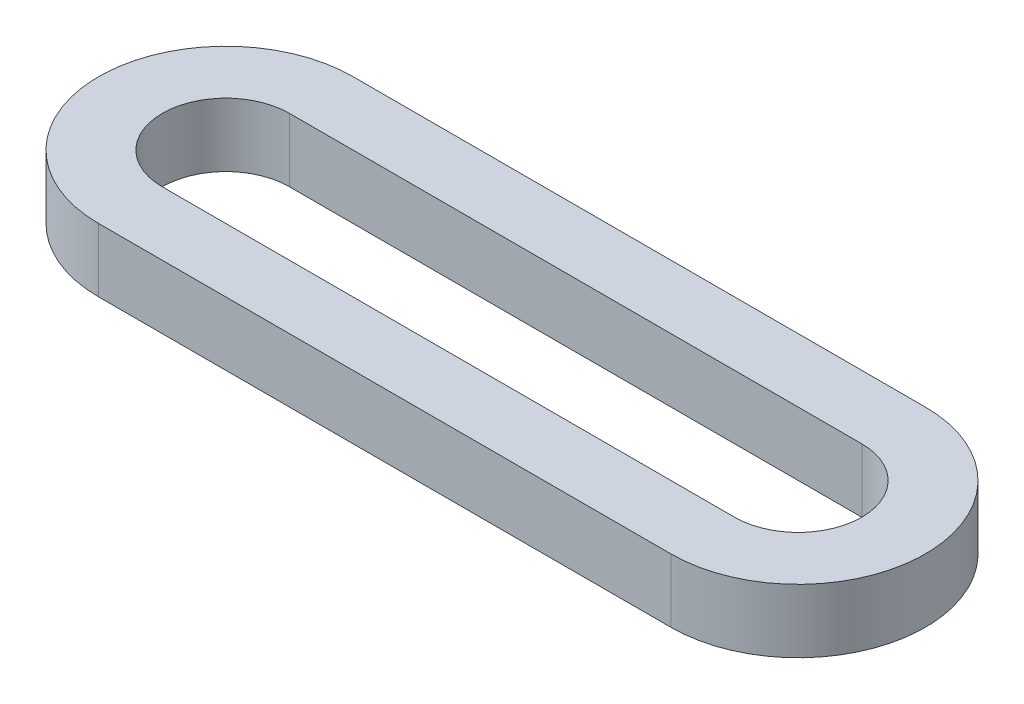
ISO-10303-21;
HEADER;
FILE_DESCRIPTION(('STEP AP214'),'2;1');
FILE_NAME('part.step','',(''),(''),'','','');
FILE_SCHEMA(('AUTOMOTIVE_DESIGN { 1 0 10303 214 1 1 1 1 }'));
ENDSEC;
DATA;
#1=APPLICATION_CONTEXT('core data for automotive mechanical design processes');
#2=APPLICATION_PROTOCOL_DEFINITION('international standard','automotive_design',2000,#1);
#3=PRODUCT_CONTEXT('',#1,'mechanical');
#4=PRODUCT('Part','Part','',(#3));
#5=PRODUCT_RELATED_PRODUCT_CATEGORY('part','',(#4));
#6=PRODUCT_DEFINITION_FORMATION('','',#4);
#7=PRODUCT_DEFINITION_CONTEXT('part definition',#1,'design');
#8=PRODUCT_DEFINITION('design','',#6,#7);
#9=PRODUCT_DEFINITION_SHAPE('','',#8);
#10=(LENGTH_UNIT() NAMED_UNIT(*) SI_UNIT(.MILLI.,.METRE.));
#11=(NAMED_UNIT(*) PLANE_ANGLE_UNIT() SI_UNIT($,.RADIAN.));
#12=(NAMED_UNIT(*) SI_UNIT($,.STERADIAN.) SOLID_ANGLE_UNIT());
#13=UNCERTAINTY_MEASURE_WITH_UNIT(LENGTH_MEASURE(1.E-05),#10,'distance_accuracy_value','');
#14=(GEOMETRIC_REPRESENTATION_CONTEXT(3) GLOBAL_UNCERTAINTY_ASSIGNED_CONTEXT((#13)) GLOBAL_UNIT_ASSIGNED_CONTEXT((#10,
#11,#12)) REPRESENTATION_CONTEXT('',''));
#15=CARTESIAN_POINT('',(0.,0.,0.));
#16=DIRECTION('',(0.,0.,1.));
#17=DIRECTION('',(1.,0.,0.));
#18=AXIS2_PLACEMENT_3D('',#15,#16,#17);
#19=CARTESIAN_POINT('',(-9.,2.,0.));
#20=DIRECTION('',(0.,-1.,0.));
#21=DIRECTION('',(0.,0.,-1.));
#22=AXIS2_PLACEMENT_3D('',#19,#20,#21);
#23=CYLINDRICAL_SURFACE('',#22,2.);
#24=CARTESIAN_POINT('',(-9.,0.,0.));
#25=DIRECTION('',(0.,1.,0.));
#26=DIRECTION('',(0.,0.,1.));
#27=AXIS2_PLACEMENT_3D('',#24,#25,#26);
#28=CIRCLE('',#27,2.);
#29=CARTESIAN_POINT('',(-9.,0.,-1.99999999999999));
#30=VERTEX_POINT('',#29);
#31=CARTESIAN_POINT('',(-9.,0.,2.));
#32=VERTEX_POINT('',#31);
#33=EDGE_CURVE('E156',#30,#32,#28,.T.);
#34=ORIENTED_EDGE('',*,*,#33,.F.);
#35=DIRECTION('',(0.,-1.,0.));
#36=VECTOR('',#35,1.);
#37=CARTESIAN_POINT('',(-9.,2.,-1.99999999999999));
#38=LINE('',#37,#36);
#39=CARTESIAN_POINT('',(-9.,2.,-1.99999999999999));
#40=VERTEX_POINT('',#39);
#41=EDGE_CURVE('E11',#40,#30,#38,.T.);
#42=ORIENTED_EDGE('',*,*,#41,.F.);
#43=CARTESIAN_POINT('',(-9.,2.,0.));
#44=DIRECTION('',(0.,1.,0.));
#45=DIRECTION('',(0.,0.,1.));
#46=AXIS2_PLACEMENT_3D('',#43,#44,#45);
#47=CIRCLE('',#46,2.);
#48=CARTESIAN_POINT('',(-9.,2.,2.));
#49=VERTEX_POINT('',#48);
#50=EDGE_CURVE('E127',#40,#49,#47,.T.);
#51=ORIENTED_EDGE('',*,*,#50,.T.);
#52=DIRECTION('',(0.,-1.,0.));
#53=VECTOR('',#52,1.);
#54=CARTESIAN_POINT('',(-9.,2.,2.));
#55=LINE('',#54,#53);
#56=EDGE_CURVE('E61',#49,#32,#55,.T.);
#57=ORIENTED_EDGE('',*,*,#56,.T.);
#58=EDGE_LOOP('',(#34,#42,#51,#57));
#59=FACE_BOUND('',#58,.T.);
#60=ADVANCED_FACE('F42',(#59),#23,.F.);
#61=CARTESIAN_POINT('',(0.,2.,-2.));
#62=DIRECTION('',(0.,0.,-1.));
#63=DIRECTION('',(-1.,0.,0.));
#64=AXIS2_PLACEMENT_3D('',#61,#62,#63);
#65=PLANE('',#64);
#66=DIRECTION('',(1.,0.,0.));
#67=VECTOR('',#66,1.);
#68=CARTESIAN_POINT('',(0.,0.,-2.));
#69=LINE('',#68,#67);
#70=CARTESIAN_POINT('',(9.,0.,-2.));
#71=VERTEX_POINT('',#70);
#72=EDGE_CURVE('E132',#30,#71,#69,.T.);
#73=ORIENTED_EDGE('',*,*,#72,.T.);
#74=DIRECTION('',(0.,-1.,0.));
#75=VECTOR('',#74,1.);
#76=CARTESIAN_POINT('',(9.,2.,-2.));
#77=LINE('',#76,#75);
#78=CARTESIAN_POINT('',(9.,2.,-2.));
#79=VERTEX_POINT('',#78);
#80=EDGE_CURVE('E52',#79,#71,#77,.T.);
#81=ORIENTED_EDGE('',*,*,#80,.F.);
#82=DIRECTION('',(1.,0.,0.));
#83=VECTOR('',#82,1.);
#84=CARTESIAN_POINT('',(0.,2.,-2.));
#85=LINE('',#84,#83);
#86=EDGE_CURVE('E122',#40,#79,#85,.T.);
#87=ORIENTED_EDGE('',*,*,#86,.F.);
#88=ORIENTED_EDGE('',*,*,#41,.T.);
#89=EDGE_LOOP('',(#73,#81,#87,#88));
#90=FACE_BOUND('',#89,.T.);
#91=ADVANCED_FACE('F130',(#90),#65,.F.);
#92=CARTESIAN_POINT('',(9.,2.,0.));
#93=DIRECTION('',(0.,-1.,0.));
#94=DIRECTION('',(0.,0.,-1.));
#95=AXIS2_PLACEMENT_3D('',#92,#93,#94);
#96=CYLINDRICAL_SURFACE('',#95,2.);
#97=CARTESIAN_POINT('',(9.,0.,0.));
#98=DIRECTION('',(0.,1.,0.));
#99=DIRECTION('',(0.,0.,1.));
#100=AXIS2_PLACEMENT_3D('',#97,#98,#99);
#101=CIRCLE('',#100,2.);
#102=CARTESIAN_POINT('',(9.,0.,1.99999999999999));
#103=VERTEX_POINT('',#102);
#104=EDGE_CURVE('E153',#71,#103,#101,.F.);
#105=ORIENTED_EDGE('',*,*,#104,.T.);
#106=DIRECTION('',(0.,-1.,0.));
#107=VECTOR('',#106,1.);
#108=CARTESIAN_POINT('',(9.,2.,1.99999999999999));
#109=LINE('',#108,#107);
#110=CARTESIAN_POINT('',(9.,2.,1.99999999999999));
#111=VERTEX_POINT('',#110);
#112=EDGE_CURVE('E87',#111,#103,#109,.T.);
#113=ORIENTED_EDGE('',*,*,#112,.F.);
#114=CARTESIAN_POINT('',(9.,2.,0.));
#115=DIRECTION('',(0.,1.,0.));
#116=DIRECTION('',(0.,0.,1.));
#117=AXIS2_PLACEMENT_3D('',#114,#115,#116);
#118=CIRCLE('',#117,2.);
#119=EDGE_CURVE('E114',#79,#111,#118,.F.);
#120=ORIENTED_EDGE('',*,*,#119,.F.);
#121=ORIENTED_EDGE('',*,*,#80,.T.);
#122=EDGE_LOOP('',(#105,#113,#120,#121));
#123=FACE_BOUND('',#122,.T.);
#124=ADVANCED_FACE('F116',(#123),#96,.F.);
#125=CARTESIAN_POINT('',(9.,2.,0.));
#126=DIRECTION('',(0.,-1.,0.));
#127=DIRECTION('',(0.,0.,-1.));
#128=AXIS2_PLACEMENT_3D('',#125,#126,#127);
#129=CYLINDRICAL_SURFACE('',#128,4.);
#130=CARTESIAN_POINT('',(9.,0.,0.));
#131=DIRECTION('',(0.,1.,0.));
#132=DIRECTION('',(0.,0.,1.));
#133=AXIS2_PLACEMENT_3D('',#130,#131,#132);
#134=CIRCLE('',#133,4.);
#135=CARTESIAN_POINT('',(9.,0.,-4.));
#136=VERTEX_POINT('',#135);
#137=CARTESIAN_POINT('',(9.,0.,3.99999999999999));
#138=VERTEX_POINT('',#137);
#139=EDGE_CURVE('E166',#136,#138,#134,.F.);
#140=ORIENTED_EDGE('',*,*,#139,.F.);
#141=DIRECTION('',(0.,-1.,0.));
#142=VECTOR('',#141,1.);
#143=CARTESIAN_POINT('',(9.,2.,-4.));
#144=LINE('',#143,#142);
#145=CARTESIAN_POINT('',(9.,2.,-4.));
#146=VERTEX_POINT('',#145);
#147=EDGE_CURVE('E46',#146,#136,#144,.T.);
#148=ORIENTED_EDGE('',*,*,#147,.F.);
#149=CARTESIAN_POINT('',(9.,2.,0.));
#150=DIRECTION('',(0.,1.,0.));
#151=DIRECTION('',(0.,0.,1.));
#152=AXIS2_PLACEMENT_3D('',#149,#150,#151);
#153=CIRCLE('',#152,4.);
#154=CARTESIAN_POINT('',(9.,2.,3.99999999999999));
#155=VERTEX_POINT('',#154);
#156=EDGE_CURVE('E152',#146,#155,#153,.F.);
#157=ORIENTED_EDGE('',*,*,#156,.T.);
#158=DIRECTION('',(0.,-1.,0.));
#159=VECTOR('',#158,1.);
#160=CARTESIAN_POINT('',(9.,2.,3.99999999999999));
#161=LINE('',#160,#159);
#162=EDGE_CURVE('E137',#155,#138,#161,.T.);
#163=ORIENTED_EDGE('',*,*,#162,.T.);
#164=EDGE_LOOP('',(#140,#148,#157,#163));
#165=FACE_BOUND('',#164,.T.);
#166=ADVANCED_FACE('F44',(#165),#129,.T.);
#167=CARTESIAN_POINT('',(0.,2.,-4.));
#168=DIRECTION('',(0.,0.,-1.));
#169=DIRECTION('',(-1.,0.,0.));
#170=AXIS2_PLACEMENT_3D('',#167,#168,#169);
#171=PLANE('',#170);
#172=DIRECTION('',(1.,0.,0.));
#173=VECTOR('',#172,1.);
#174=CARTESIAN_POINT('',(0.,0.,-4.));
#175=LINE('',#174,#173);
#176=CARTESIAN_POINT('',(-9.,0.,-4.));
#177=VERTEX_POINT('',#176);
#178=EDGE_CURVE('E163',#177,#136,#175,.T.);
#179=ORIENTED_EDGE('',*,*,#178,.F.);
#180=DIRECTION('',(0.,-1.,0.));
#181=VECTOR('',#180,1.);
#182=CARTESIAN_POINT('',(-9.,2.,-4.));
#183=LINE('',#182,#181);
#184=CARTESIAN_POINT('',(-9.,2.,-4.));
#185=VERTEX_POINT('',#184);
#186=EDGE_CURVE('E141',#185,#177,#183,.T.);
#187=ORIENTED_EDGE('',*,*,#186,.F.);
#188=DIRECTION('',(1.,0.,0.));
#189=VECTOR('',#188,1.);
#190=CARTESIAN_POINT('',(0.,2.,-4.));
#191=LINE('',#190,#189);
#192=EDGE_CURVE('E175',#185,#146,#191,.T.);
#193=ORIENTED_EDGE('',*,*,#192,.T.);
#194=ORIENTED_EDGE('',*,*,#147,.T.);
#195=EDGE_LOOP('',(#179,#187,#193,#194));
#196=FACE_BOUND('',#195,.T.);
#197=ADVANCED_FACE('F181',(#196),#171,.T.);
#198=CARTESIAN_POINT('',(-9.,2.,0.));
#199=DIRECTION('',(0.,-1.,0.));
#200=DIRECTION('',(0.,0.,-1.));
#201=AXIS2_PLACEMENT_3D('',#198,#199,#200);
#202=CYLINDRICAL_SURFACE('',#201,4.);
#203=CARTESIAN_POINT('',(-9.,0.,0.));
#204=DIRECTION('',(0.,1.,0.));
#205=DIRECTION('',(0.,0.,1.));
#206=AXIS2_PLACEMENT_3D('',#203,#204,#205);
#207=CIRCLE('',#206,4.);
#208=CARTESIAN_POINT('',(-9.,0.,4.));
#209=VERTEX_POINT('',#208);
#210=EDGE_CURVE('E161',#177,#209,#207,.T.);
#211=ORIENTED_EDGE('',*,*,#210,.T.);
#212=DIRECTION('',(0.,-1.,0.));
#213=VECTOR('',#212,1.);
#214=CARTESIAN_POINT('',(-9.,2.,4.));
#215=LINE('',#214,#213);
#216=CARTESIAN_POINT('',(-9.,2.,4.));
#217=VERTEX_POINT('',#216);
#218=EDGE_CURVE('E139',#217,#209,#215,.T.);
#219=ORIENTED_EDGE('',*,*,#218,.F.);
#220=CARTESIAN_POINT('',(-9.,2.,0.));
#221=DIRECTION('',(0.,1.,0.));
#222=DIRECTION('',(0.,0.,1.));
#223=AXIS2_PLACEMENT_3D('',#220,#221,#222);
#224=CIRCLE('',#223,4.);
#225=EDGE_CURVE('E173',#185,#217,#224,.T.);
#226=ORIENTED_EDGE('',*,*,#225,.F.);
#227=ORIENTED_EDGE('',*,*,#186,.T.);
#228=EDGE_LOOP('',(#211,#219,#226,#227));
#229=FACE_BOUND('',#228,.T.);
#230=ADVANCED_FACE('F183',(#229),#202,.T.);
#231=CARTESIAN_POINT('',(0.,2.,4.));
#232=DIRECTION('',(0.,0.,-1.));
#233=DIRECTION('',(-1.,0.,0.));
#234=AXIS2_PLACEMENT_3D('',#231,#232,#233);
#235=PLANE('',#234);
#236=DIRECTION('',(1.,0.,0.));
#237=VECTOR('',#236,1.);
#238=CARTESIAN_POINT('',(0.,0.,4.));
#239=LINE('',#238,#237);
#240=EDGE_CURVE('E158',#209,#138,#239,.T.);
#241=ORIENTED_EDGE('',*,*,#240,.T.);
#242=ORIENTED_EDGE('',*,*,#162,.F.);
#243=DIRECTION('',(1.,0.,0.));
#244=VECTOR('',#243,1.);
#245=CARTESIAN_POINT('',(0.,2.,4.));
#246=LINE('',#245,#244);
#247=EDGE_CURVE('E171',#217,#155,#246,.T.);
#248=ORIENTED_EDGE('',*,*,#247,.F.);
#249=ORIENTED_EDGE('',*,*,#218,.T.);
#250=EDGE_LOOP('',(#241,#242,#248,#249));
#251=FACE_BOUND('',#250,.T.);
#252=ADVANCED_FACE('F186',(#251),#235,.F.);
#253=CARTESIAN_POINT('',(0.,2.,2.));
#254=DIRECTION('',(0.,0.,-1.));
#255=DIRECTION('',(-1.,0.,0.));
#256=AXIS2_PLACEMENT_3D('',#253,#254,#255);
#257=PLANE('',#256);
#258=DIRECTION('',(1.,0.,0.));
#259=VECTOR('',#258,1.);
#260=CARTESIAN_POINT('',(0.,0.,2.));
#261=LINE('',#260,#259);
#262=EDGE_CURVE('E149',#32,#103,#261,.T.);
#263=ORIENTED_EDGE('',*,*,#262,.F.);
#264=ORIENTED_EDGE('',*,*,#56,.F.);
#265=DIRECTION('',(1.,0.,0.));
#266=VECTOR('',#265,1.);
#267=CARTESIAN_POINT('',(0.,2.,2.));
#268=LINE('',#267,#266);
#269=EDGE_CURVE('E121',#49,#111,#268,.T.);
#270=ORIENTED_EDGE('',*,*,#269,.T.);
#271=ORIENTED_EDGE('',*,*,#112,.T.);
#272=EDGE_LOOP('',(#263,#264,#270,#271));
#273=FACE_BOUND('',#272,.T.);
#274=ADVANCED_FACE('F192',(#273),#257,.T.);
#275=CARTESIAN_POINT('',(0.,2.,0.));
#276=DIRECTION('',(0.,1.,0.));
#277=DIRECTION('',(0.,0.,1.));
#278=AXIS2_PLACEMENT_3D('',#275,#276,#277);
#279=PLANE('',#278);
#280=ORIENTED_EDGE('',*,*,#156,.F.);
#281=ORIENTED_EDGE('',*,*,#192,.F.);
#282=ORIENTED_EDGE('',*,*,#225,.T.);
#283=ORIENTED_EDGE('',*,*,#247,.T.);
#284=EDGE_LOOP('',(#280,#281,#282,#283));
#285=FACE_BOUND('',#284,.T.);
#286=ORIENTED_EDGE('',*,*,#50,.F.);
#287=ORIENTED_EDGE('',*,*,#86,.T.);
#288=ORIENTED_EDGE('',*,*,#119,.T.);
#289=ORIENTED_EDGE('',*,*,#269,.F.);
#290=EDGE_LOOP('',(#286,#287,#288,#289));
#291=FACE_BOUND('',#290,.T.);
#292=ADVANCED_FACE('F126',(#285,#291),#279,.T.);
#293=CARTESIAN_POINT('',(0.,0.,0.));
#294=DIRECTION('',(0.,1.,0.));
#295=DIRECTION('',(0.,0.,1.));
#296=AXIS2_PLACEMENT_3D('',#293,#294,#295);
#297=PLANE('',#296);
#298=ORIENTED_EDGE('',*,*,#139,.T.);
#299=ORIENTED_EDGE('',*,*,#240,.F.);
#300=ORIENTED_EDGE('',*,*,#210,.F.);
#301=ORIENTED_EDGE('',*,*,#178,.T.);
#302=EDGE_LOOP('',(#298,#299,#300,#301));
#303=FACE_BOUND('',#302,.T.);
#304=ORIENTED_EDGE('',*,*,#33,.T.);
#305=ORIENTED_EDGE('',*,*,#262,.T.);
#306=ORIENTED_EDGE('',*,*,#104,.F.);
#307=ORIENTED_EDGE('',*,*,#72,.F.);
#308=EDGE_LOOP('',(#304,#305,#306,#307));
#309=FACE_BOUND('',#308,.T.);
#310=ADVANCED_FACE('F188',(#303,#309),#297,.F.);
#311=CLOSED_SHELL('',(#60,#91,#124,#166,#197,#230,#252,#274,#292,#310));
#312=MANIFOLD_SOLID_BREP('B2',#311);
#313=ADVANCED_BREP_SHAPE_REPRESENTATION('',(#18,#312),#14);
#314=SHAPE_DEFINITION_REPRESENTATION(#9,#313);
ENDSEC;
END-ISO-10303-21;
